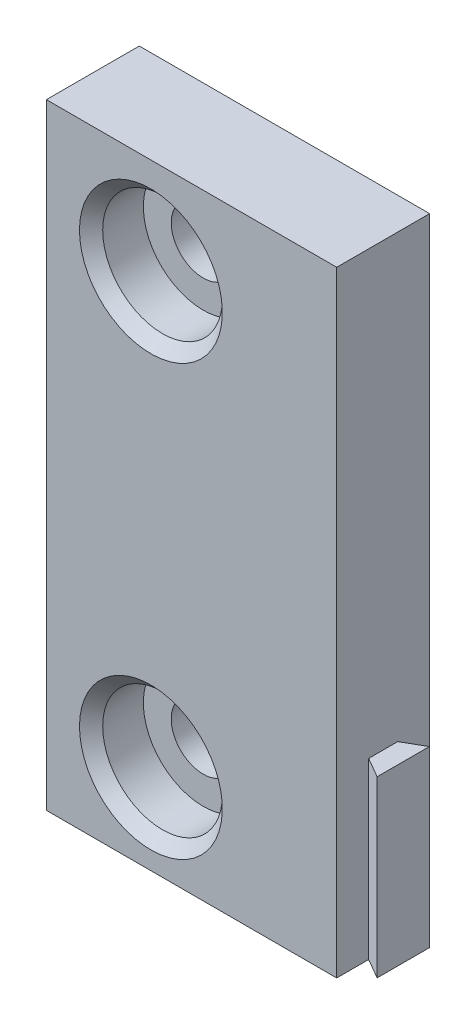
ISO-10303-21;
HEADER;
FILE_DESCRIPTION(('STEP AP214'),'2;1');
FILE_NAME('part.step','',(''),(''),'','','');
FILE_SCHEMA(('AUTOMOTIVE_DESIGN { 1 0 10303 214 1 1 1 1 }'));
ENDSEC;
DATA;
#1=APPLICATION_CONTEXT('core data for automotive mechanical design processes');
#2=APPLICATION_PROTOCOL_DEFINITION('international standard','automotive_design',2000,#1);
#3=PRODUCT_CONTEXT('',#1,'mechanical');
#4=PRODUCT('Part','Part','',(#3));
#5=PRODUCT_RELATED_PRODUCT_CATEGORY('part','',(#4));
#6=PRODUCT_DEFINITION_FORMATION('','',#4);
#7=PRODUCT_DEFINITION_CONTEXT('part definition',#1,'design');
#8=PRODUCT_DEFINITION('design','',#6,#7);
#9=PRODUCT_DEFINITION_SHAPE('','',#8);
#10=(LENGTH_UNIT() NAMED_UNIT(*) SI_UNIT(.MILLI.,.METRE.));
#11=(NAMED_UNIT(*) PLANE_ANGLE_UNIT() SI_UNIT($,.RADIAN.));
#12=(NAMED_UNIT(*) SI_UNIT($,.STERADIAN.) SOLID_ANGLE_UNIT());
#13=UNCERTAINTY_MEASURE_WITH_UNIT(LENGTH_MEASURE(1.E-05),#10,'distance_accuracy_value','');
#14=(GEOMETRIC_REPRESENTATION_CONTEXT(3) GLOBAL_UNCERTAINTY_ASSIGNED_CONTEXT((#13)) GLOBAL_UNIT_ASSIGNED_CONTEXT((#10,
#11,#12)) REPRESENTATION_CONTEXT('',''));
#15=CARTESIAN_POINT('',(0.,0.,0.));
#16=DIRECTION('',(0.,0.,1.));
#17=DIRECTION('',(1.,0.,0.));
#18=AXIS2_PLACEMENT_3D('',#15,#16,#17);
#19=CARTESIAN_POINT('',(9.,44.7,8.));
#20=DIRECTION('',(0.,0.,-1.));
#21=DIRECTION('',(-1.,0.,0.));
#22=AXIS2_PLACEMENT_3D('',#19,#20,#21);
#23=CYLINDRICAL_SURFACE('',#22,2.75);
#24=CARTESIAN_POINT('',(9.,44.7,0.));
#25=DIRECTION('',(0.,0.,1.));
#26=DIRECTION('',(1.,0.,0.));
#27=AXIS2_PLACEMENT_3D('',#24,#25,#26);
#28=CIRCLE('',#27,2.75);
#29=CARTESIAN_POINT('',(11.75,44.7,0.));
#30=VERTEX_POINT('',#29);
#31=EDGE_CURVE('E177',#30,#30,#28,.T.);
#32=ORIENTED_EDGE('',*,*,#31,.F.);
#33=EDGE_LOOP('',(#32));
#34=FACE_BOUND('',#33,.T.);
#35=CARTESIAN_POINT('',(9.,44.7,3.5));
#36=DIRECTION('',(0.,0.,1.));
#37=DIRECTION('',(1.,0.,0.));
#38=AXIS2_PLACEMENT_3D('',#35,#36,#37);
#39=CIRCLE('',#38,2.75);
#40=CARTESIAN_POINT('',(11.75,44.7,3.5));
#41=VERTEX_POINT('',#40);
#42=EDGE_CURVE('E162',#41,#41,#39,.T.);
#43=ORIENTED_EDGE('',*,*,#42,.T.);
#44=EDGE_LOOP('',(#43));
#45=FACE_BOUND('',#44,.T.);
#46=ADVANCED_FACE('F45',(#34,#45),#23,.F.);
#47=CARTESIAN_POINT('',(9.,7.7,8.));
#48=DIRECTION('',(0.,0.,-1.));
#49=DIRECTION('',(-1.,0.,0.));
#50=AXIS2_PLACEMENT_3D('',#47,#48,#49);
#51=CYLINDRICAL_SURFACE('',#50,2.75);
#52=CARTESIAN_POINT('',(9.,7.7,0.));
#53=DIRECTION('',(0.,0.,1.));
#54=DIRECTION('',(1.,0.,0.));
#55=AXIS2_PLACEMENT_3D('',#52,#53,#54);
#56=CIRCLE('',#55,2.75);
#57=CARTESIAN_POINT('',(11.75,7.7,0.));
#58=VERTEX_POINT('',#57);
#59=EDGE_CURVE('E168',#58,#58,#56,.T.);
#60=ORIENTED_EDGE('',*,*,#59,.F.);
#61=EDGE_LOOP('',(#60));
#62=FACE_BOUND('',#61,.T.);
#63=CARTESIAN_POINT('',(9.,7.7,3.5));
#64=DIRECTION('',(0.,0.,1.));
#65=DIRECTION('',(1.,0.,0.));
#66=AXIS2_PLACEMENT_3D('',#63,#64,#65);
#67=CIRCLE('',#66,2.75);
#68=CARTESIAN_POINT('',(11.75,7.7,3.5));
#69=VERTEX_POINT('',#68);
#70=EDGE_CURVE('E218',#69,#69,#67,.T.);
#71=ORIENTED_EDGE('',*,*,#70,.T.);
#72=EDGE_LOOP('',(#71));
#73=FACE_BOUND('',#72,.T.);
#74=ADVANCED_FACE('F272',(#62,#73),#51,.F.);
#75=CARTESIAN_POINT('',(25.,0.,8.));
#76=DIRECTION('',(-1.,0.,0.));
#77=DIRECTION('',(0.,-1.,0.));
#78=AXIS2_PLACEMENT_3D('',#75,#76,#77);
#79=PLANE('',#78);
#80=DIRECTION('',(0.,-1.,0.));
#81=VECTOR('',#80,1.);
#82=CARTESIAN_POINT('',(25.,15.,5.25));
#83=LINE('',#82,#81);
#84=CARTESIAN_POINT('',(25.,15.,5.25));
#85=VERTEX_POINT('',#84);
#86=CARTESIAN_POINT('',(25.,0.,5.25));
#87=VERTEX_POINT('',#86);
#88=EDGE_CURVE('E144',#85,#87,#83,.T.);
#89=ORIENTED_EDGE('',*,*,#88,.F.);
#90=DIRECTION('',(0.,0.,-1.));
#91=VECTOR('',#90,1.);
#92=CARTESIAN_POINT('',(25.,15.,2.75));
#93=LINE('',#92,#91);
#94=CARTESIAN_POINT('',(25.,15.,2.75));
#95=VERTEX_POINT('',#94);
#96=EDGE_CURVE('E135',#85,#95,#93,.T.);
#97=ORIENTED_EDGE('',*,*,#96,.T.);
#98=DIRECTION('',(0.,-1.,0.));
#99=VECTOR('',#98,1.);
#100=CARTESIAN_POINT('',(25.,15.,2.75));
#101=LINE('',#100,#99);
#102=CARTESIAN_POINT('',(25.,0.,2.75));
#103=VERTEX_POINT('',#102);
#104=EDGE_CURVE('E120',#95,#103,#101,.T.);
#105=ORIENTED_EDGE('',*,*,#104,.T.);
#106=DIRECTION('',(0.,0.,-1.));
#107=VECTOR('',#106,1.);
#108=CARTESIAN_POINT('',(25.,0.,8.));
#109=LINE('',#108,#107);
#110=CARTESIAN_POINT('',(25.,0.,0.));
#111=VERTEX_POINT('',#110);
#112=EDGE_CURVE('E210',#103,#111,#109,.T.);
#113=ORIENTED_EDGE('',*,*,#112,.T.);
#114=DIRECTION('',(0.,1.,0.));
#115=VECTOR('',#114,1.);
#116=CARTESIAN_POINT('',(25.,0.,0.));
#117=LINE('',#116,#115);
#118=CARTESIAN_POINT('',(25.,53.,0.));
#119=VERTEX_POINT('',#118);
#120=EDGE_CURVE('E200',#111,#119,#117,.T.);
#121=ORIENTED_EDGE('',*,*,#120,.T.);
#122=DIRECTION('',(0.,0.,-1.));
#123=VECTOR('',#122,1.);
#124=CARTESIAN_POINT('',(25.,53.,8.));
#125=LINE('',#124,#123);
#126=CARTESIAN_POINT('',(25.,53.,8.));
#127=VERTEX_POINT('',#126);
#128=EDGE_CURVE('E207',#127,#119,#125,.T.);
#129=ORIENTED_EDGE('',*,*,#128,.F.);
#130=DIRECTION('',(0.,1.,0.));
#131=VECTOR('',#130,1.);
#132=CARTESIAN_POINT('',(25.,0.,8.));
#133=LINE('',#132,#131);
#134=CARTESIAN_POINT('',(25.,0.,8.));
#135=VERTEX_POINT('',#134);
#136=EDGE_CURVE('E187',#135,#127,#133,.T.);
#137=ORIENTED_EDGE('',*,*,#136,.F.);
#138=EDGE_CURVE('E211',#135,#87,#109,.T.);
#139=ORIENTED_EDGE('',*,*,#138,.T.);
#140=EDGE_LOOP('',(#89,#97,#105,#113,#121,#129,#137,#139));
#141=FACE_BOUND('',#140,.T.);
#142=ADVANCED_FACE('F142',(#141),#79,.F.);
#143=CARTESIAN_POINT('',(0.,0.,8.));
#144=DIRECTION('',(0.,0.,-1.));
#145=DIRECTION('',(-1.,0.,0.));
#146=AXIS2_PLACEMENT_3D('',#143,#144,#145);
#147=PLANE('',#146);
#148=CARTESIAN_POINT('',(9.,7.7,8.));
#149=DIRECTION('',(0.,0.,-1.));
#150=DIRECTION('',(-1.,0.,0.));
#151=AXIS2_PLACEMENT_3D('',#148,#149,#150);
#152=CIRCLE('',#151,6.15000000000001);
#153=CARTESIAN_POINT('',(2.84999999999999,7.7,8.));
#154=VERTEX_POINT('',#153);
#155=EDGE_CURVE('E55',#154,#154,#152,.T.);
#156=ORIENTED_EDGE('',*,*,#155,.T.);
#157=EDGE_LOOP('',(#156));
#158=FACE_BOUND('',#157,.T.);
#159=CARTESIAN_POINT('',(9.,44.7,8.));
#160=DIRECTION('',(0.,0.,-1.));
#161=DIRECTION('',(-1.,0.,0.));
#162=AXIS2_PLACEMENT_3D('',#159,#160,#161);
#163=CIRCLE('',#162,6.15000000000001);
#164=CARTESIAN_POINT('',(2.84999999999999,44.7,8.));
#165=VERTEX_POINT('',#164);
#166=EDGE_CURVE('E229',#165,#165,#163,.T.);
#167=ORIENTED_EDGE('',*,*,#166,.T.);
#168=EDGE_LOOP('',(#167));
#169=FACE_BOUND('',#168,.T.);
#170=DIRECTION('',(0.,-1.,0.));
#171=VECTOR('',#170,1.);
#172=CARTESIAN_POINT('',(0.,0.,8.));
#173=LINE('',#172,#171);
#174=CARTESIAN_POINT('',(0.,53.,8.));
#175=VERTEX_POINT('',#174);
#176=CARTESIAN_POINT('',(0.,0.,8.));
#177=VERTEX_POINT('',#176);
#178=EDGE_CURVE('E182',#175,#177,#173,.T.);
#179=ORIENTED_EDGE('',*,*,#178,.T.);
#180=DIRECTION('',(1.,0.,0.));
#181=VECTOR('',#180,1.);
#182=CARTESIAN_POINT('',(0.,0.,8.));
#183=LINE('',#182,#181);
#184=EDGE_CURVE('E100',#177,#135,#183,.T.);
#185=ORIENTED_EDGE('',*,*,#184,.T.);
#186=ORIENTED_EDGE('',*,*,#136,.T.);
#187=DIRECTION('',(-1.,0.,0.));
#188=VECTOR('',#187,1.);
#189=CARTESIAN_POINT('',(0.,53.,8.));
#190=LINE('',#189,#188);
#191=EDGE_CURVE('E71',#127,#175,#190,.T.);
#192=ORIENTED_EDGE('',*,*,#191,.T.);
#193=EDGE_LOOP('',(#179,#185,#186,#192));
#194=FACE_BOUND('',#193,.T.);
#195=ADVANCED_FACE('F236',(#158,#169,#194),#147,.F.);
#196=CARTESIAN_POINT('',(0.,0.,0.));
#197=DIRECTION('',(0.,0.,-1.));
#198=DIRECTION('',(-1.,0.,0.));
#199=AXIS2_PLACEMENT_3D('',#196,#197,#198);
#200=PLANE('',#199);
#201=ORIENTED_EDGE('',*,*,#31,.T.);
#202=EDGE_LOOP('',(#201));
#203=FACE_BOUND('',#202,.T.);
#204=DIRECTION('',(0.,-1.,0.));
#205=VECTOR('',#204,1.);
#206=CARTESIAN_POINT('',(0.,0.,0.));
#207=LINE('',#206,#205);
#208=CARTESIAN_POINT('',(0.,53.,0.));
#209=VERTEX_POINT('',#208);
#210=CARTESIAN_POINT('',(0.,0.,0.));
#211=VERTEX_POINT('',#210);
#212=EDGE_CURVE('E181',#209,#211,#207,.T.);
#213=ORIENTED_EDGE('',*,*,#212,.F.);
#214=DIRECTION('',(-1.,0.,0.));
#215=VECTOR('',#214,1.);
#216=CARTESIAN_POINT('',(0.,53.,0.));
#217=LINE('',#216,#215);
#218=EDGE_CURVE('E92',#119,#209,#217,.T.);
#219=ORIENTED_EDGE('',*,*,#218,.F.);
#220=ORIENTED_EDGE('',*,*,#120,.F.);
#221=DIRECTION('',(1.,0.,0.));
#222=VECTOR('',#221,1.);
#223=CARTESIAN_POINT('',(0.,0.,0.));
#224=LINE('',#223,#222);
#225=EDGE_CURVE('E196',#211,#111,#224,.T.);
#226=ORIENTED_EDGE('',*,*,#225,.F.);
#227=EDGE_LOOP('',(#213,#219,#220,#226));
#228=FACE_BOUND('',#227,.T.);
#229=ORIENTED_EDGE('',*,*,#59,.T.);
#230=EDGE_LOOP('',(#229));
#231=FACE_BOUND('',#230,.T.);
#232=ADVANCED_FACE('F286',(#203,#228,#231),#200,.T.);
#233=CARTESIAN_POINT('',(0.,0.,8.));
#234=DIRECTION('',(1.,0.,0.));
#235=DIRECTION('',(0.,1.,0.));
#236=AXIS2_PLACEMENT_3D('',#233,#234,#235);
#237=PLANE('',#236);
#238=ORIENTED_EDGE('',*,*,#212,.T.);
#239=DIRECTION('',(0.,0.,-1.));
#240=VECTOR('',#239,1.);
#241=CARTESIAN_POINT('',(0.,0.,8.));
#242=LINE('',#241,#240);
#243=EDGE_CURVE('E214',#177,#211,#242,.T.);
#244=ORIENTED_EDGE('',*,*,#243,.F.);
#245=ORIENTED_EDGE('',*,*,#178,.F.);
#246=DIRECTION('',(0.,0.,-1.));
#247=VECTOR('',#246,1.);
#248=CARTESIAN_POINT('',(0.,53.,8.));
#249=LINE('',#248,#247);
#250=EDGE_CURVE('E192',#175,#209,#249,.T.);
#251=ORIENTED_EDGE('',*,*,#250,.T.);
#252=EDGE_LOOP('',(#238,#244,#245,#251));
#253=FACE_BOUND('',#252,.T.);
#254=ADVANCED_FACE('F289',(#253),#237,.F.);
#255=CARTESIAN_POINT('',(0.,0.,8.));
#256=DIRECTION('',(0.,1.,0.));
#257=DIRECTION('',(0.,0.,1.));
#258=AXIS2_PLACEMENT_3D('',#255,#256,#257);
#259=PLANE('',#258);
#260=ORIENTED_EDGE('',*,*,#225,.T.);
#261=ORIENTED_EDGE('',*,*,#112,.F.);
#262=DIRECTION('',(0.86602540378444,0.,-0.499999999999998));
#263=VECTOR('',#262,1.);
#264=CARTESIAN_POINT('',(25.,0.,2.75));
#265=LINE('',#264,#263);
#266=CARTESIAN_POINT('',(26.7320508075689,0.,1.75));
#267=VERTEX_POINT('',#266);
#268=EDGE_CURVE('E62',#103,#267,#265,.T.);
#269=ORIENTED_EDGE('',*,*,#268,.T.);
#270=DIRECTION('',(0.,0.,1.));
#271=VECTOR('',#270,1.);
#272=CARTESIAN_POINT('',(26.7320508075689,0.,1.75));
#273=LINE('',#272,#271);
#274=CARTESIAN_POINT('',(26.7320508075689,0.,6.25));
#275=VERTEX_POINT('',#274);
#276=EDGE_CURVE('E150',#267,#275,#273,.T.);
#277=ORIENTED_EDGE('',*,*,#276,.T.);
#278=DIRECTION('',(-0.86602540378444,0.,-0.499999999999998));
#279=VECTOR('',#278,1.);
#280=CARTESIAN_POINT('',(26.7320508075689,0.,6.25));
#281=LINE('',#280,#279);
#282=EDGE_CURVE('E146',#275,#87,#281,.T.);
#283=ORIENTED_EDGE('',*,*,#282,.T.);
#284=ORIENTED_EDGE('',*,*,#138,.F.);
#285=ORIENTED_EDGE('',*,*,#184,.F.);
#286=ORIENTED_EDGE('',*,*,#243,.T.);
#287=EDGE_LOOP('',(#260,#261,#269,#277,#283,#284,#285,#286));
#288=FACE_BOUND('',#287,.T.);
#289=ADVANCED_FACE('F295',(#288),#259,.F.);
#290=CARTESIAN_POINT('',(0.,53.,8.));
#291=DIRECTION('',(0.,-1.,0.));
#292=DIRECTION('',(0.,0.,-1.));
#293=AXIS2_PLACEMENT_3D('',#290,#291,#292);
#294=PLANE('',#293);
#295=ORIENTED_EDGE('',*,*,#218,.T.);
#296=ORIENTED_EDGE('',*,*,#250,.F.);
#297=ORIENTED_EDGE('',*,*,#191,.F.);
#298=ORIENTED_EDGE('',*,*,#128,.T.);
#299=EDGE_LOOP('',(#295,#296,#297,#298));
#300=FACE_BOUND('',#299,.T.);
#301=ADVANCED_FACE('F291',(#300),#294,.F.);
#302=CARTESIAN_POINT('',(26.7320508075689,15.,6.25));
#303=DIRECTION('',(-0.499999999999998,0.,0.86602540378444));
#304=DIRECTION('',(0.86602540378444,0.,0.499999999999998));
#305=AXIS2_PLACEMENT_3D('',#302,#303,#304);
#306=PLANE('',#305);
#307=ORIENTED_EDGE('',*,*,#282,.F.);
#308=DIRECTION('',(0.,-1.,0.));
#309=VECTOR('',#308,1.);
#310=CARTESIAN_POINT('',(26.7320508075689,15.,6.25));
#311=LINE('',#310,#309);
#312=CARTESIAN_POINT('',(26.7320508075689,15.,6.25));
#313=VERTEX_POINT('',#312);
#314=EDGE_CURVE('E169',#313,#275,#311,.T.);
#315=ORIENTED_EDGE('',*,*,#314,.F.);
#316=DIRECTION('',(-0.86602540378444,0.,-0.499999999999998));
#317=VECTOR('',#316,1.);
#318=CARTESIAN_POINT('',(26.7320508075689,15.,6.25));
#319=LINE('',#318,#317);
#320=EDGE_CURVE('E129',#313,#85,#319,.T.);
#321=ORIENTED_EDGE('',*,*,#320,.T.);
#322=ORIENTED_EDGE('',*,*,#88,.T.);
#323=EDGE_LOOP('',(#307,#315,#321,#322));
#324=FACE_BOUND('',#323,.T.);
#325=ADVANCED_FACE('F294',(#324),#306,.T.);
#326=CARTESIAN_POINT('',(26.7320508075689,15.,1.75));
#327=DIRECTION('',(1.,0.,0.));
#328=DIRECTION('',(0.,0.,-1.));
#329=AXIS2_PLACEMENT_3D('',#326,#327,#328);
#330=PLANE('',#329);
#331=ORIENTED_EDGE('',*,*,#276,.F.);
#332=DIRECTION('',(0.,-1.,0.));
#333=VECTOR('',#332,1.);
#334=CARTESIAN_POINT('',(26.7320508075689,15.,1.75));
#335=LINE('',#334,#333);
#336=CARTESIAN_POINT('',(26.7320508075689,15.,1.75));
#337=VERTEX_POINT('',#336);
#338=EDGE_CURVE('E128',#337,#267,#335,.T.);
#339=ORIENTED_EDGE('',*,*,#338,.F.);
#340=DIRECTION('',(0.,0.,1.));
#341=VECTOR('',#340,1.);
#342=CARTESIAN_POINT('',(26.7320508075689,15.,1.75));
#343=LINE('',#342,#341);
#344=EDGE_CURVE('E138',#337,#313,#343,.T.);
#345=ORIENTED_EDGE('',*,*,#344,.T.);
#346=ORIENTED_EDGE('',*,*,#314,.T.);
#347=EDGE_LOOP('',(#331,#339,#345,#346));
#348=FACE_BOUND('',#347,.T.);
#349=ADVANCED_FACE('F322',(#348),#330,.T.);
#350=CARTESIAN_POINT('',(25.,15.,2.75));
#351=DIRECTION('',(-0.499999999999998,0.,-0.86602540378444));
#352=DIRECTION('',(-0.86602540378444,0.,0.499999999999998));
#353=AXIS2_PLACEMENT_3D('',#350,#351,#352);
#354=PLANE('',#353);
#355=ORIENTED_EDGE('',*,*,#268,.F.);
#356=ORIENTED_EDGE('',*,*,#104,.F.);
#357=DIRECTION('',(0.86602540378444,0.,-0.499999999999998));
#358=VECTOR('',#357,1.);
#359=CARTESIAN_POINT('',(25.,15.,2.75));
#360=LINE('',#359,#358);
#361=EDGE_CURVE('E123',#95,#337,#360,.T.);
#362=ORIENTED_EDGE('',*,*,#361,.T.);
#363=ORIENTED_EDGE('',*,*,#338,.T.);
#364=EDGE_LOOP('',(#355,#356,#362,#363));
#365=FACE_BOUND('',#364,.T.);
#366=ADVANCED_FACE('F122',(#365),#354,.T.);
#367=CARTESIAN_POINT('',(0.,15.,0.));
#368=DIRECTION('',(0.,-1.,0.));
#369=DIRECTION('',(0.,0.,-1.));
#370=AXIS2_PLACEMENT_3D('',#367,#368,#369);
#371=PLANE('',#370);
#372=ORIENTED_EDGE('',*,*,#96,.F.);
#373=ORIENTED_EDGE('',*,*,#320,.F.);
#374=ORIENTED_EDGE('',*,*,#344,.F.);
#375=ORIENTED_EDGE('',*,*,#361,.F.);
#376=EDGE_LOOP('',(#372,#373,#374,#375));
#377=FACE_BOUND('',#376,.T.);
#378=ADVANCED_FACE('F133',(#377),#371,.F.);
#379=CARTESIAN_POINT('',(9.,7.7,3.5));
#380=DIRECTION('',(0.,0.,1.));
#381=DIRECTION('',(1.,0.,0.));
#382=AXIS2_PLACEMENT_3D('',#379,#380,#381);
#383=CYLINDRICAL_SURFACE('',#382,5.15);
#384=CARTESIAN_POINT('',(9.,7.7,7.));
#385=DIRECTION('',(0.,0.,-1.));
#386=DIRECTION('',(-1.,0.,0.));
#387=AXIS2_PLACEMENT_3D('',#384,#385,#386);
#388=CIRCLE('',#387,5.15);
#389=CARTESIAN_POINT('',(3.84999999999999,7.7,7.));
#390=VERTEX_POINT('',#389);
#391=EDGE_CURVE('E217',#390,#390,#388,.F.);
#392=ORIENTED_EDGE('',*,*,#391,.T.);
#393=EDGE_LOOP('',(#392));
#394=FACE_BOUND('',#393,.T.);
#395=CARTESIAN_POINT('',(9.,7.7,3.5));
#396=DIRECTION('',(0.,0.,1.));
#397=DIRECTION('',(1.,0.,0.));
#398=AXIS2_PLACEMENT_3D('',#395,#396,#397);
#399=CIRCLE('',#398,5.15);
#400=CARTESIAN_POINT('',(14.15,7.7,3.5));
#401=VERTEX_POINT('',#400);
#402=EDGE_CURVE('E153',#401,#401,#399,.T.);
#403=ORIENTED_EDGE('',*,*,#402,.F.);
#404=EDGE_LOOP('',(#403));
#405=FACE_BOUND('',#404,.T.);
#406=ADVANCED_FACE('F245',(#394,#405),#383,.F.);
#407=CARTESIAN_POINT('',(9.,7.7,3.5));
#408=DIRECTION('',(0.,0.,1.));
#409=DIRECTION('',(1.,0.,0.));
#410=AXIS2_PLACEMENT_3D('',#407,#408,#409);
#411=PLANE('',#410);
#412=ORIENTED_EDGE('',*,*,#70,.F.);
#413=EDGE_LOOP('',(#412));
#414=FACE_BOUND('',#413,.T.);
#415=ORIENTED_EDGE('',*,*,#402,.T.);
#416=EDGE_LOOP('',(#415));
#417=FACE_BOUND('',#416,.T.);
#418=ADVANCED_FACE('F248',(#414,#417),#411,.T.);
#419=CARTESIAN_POINT('',(9.,44.7,3.5));
#420=DIRECTION('',(0.,0.,1.));
#421=DIRECTION('',(1.,0.,0.));
#422=AXIS2_PLACEMENT_3D('',#419,#420,#421);
#423=CYLINDRICAL_SURFACE('',#422,5.15000000000001);
#424=CARTESIAN_POINT('',(9.,44.7,7.));
#425=DIRECTION('',(0.,0.,-1.));
#426=DIRECTION('',(-1.,0.,0.));
#427=AXIS2_PLACEMENT_3D('',#424,#425,#426);
#428=CIRCLE('',#427,5.15000000000001);
#429=CARTESIAN_POINT('',(3.84999999999999,44.7,7.));
#430=VERTEX_POINT('',#429);
#431=EDGE_CURVE('E11',#430,#430,#428,.F.);
#432=ORIENTED_EDGE('',*,*,#431,.T.);
#433=EDGE_LOOP('',(#432));
#434=FACE_BOUND('',#433,.T.);
#435=CARTESIAN_POINT('',(9.,44.7,3.5));
#436=DIRECTION('',(0.,0.,1.));
#437=DIRECTION('',(1.,0.,0.));
#438=AXIS2_PLACEMENT_3D('',#435,#436,#437);
#439=CIRCLE('',#438,5.15000000000001);
#440=CARTESIAN_POINT('',(14.15,44.7,3.5));
#441=VERTEX_POINT('',#440);
#442=EDGE_CURVE('E222',#441,#441,#439,.T.);
#443=ORIENTED_EDGE('',*,*,#442,.F.);
#444=EDGE_LOOP('',(#443));
#445=FACE_BOUND('',#444,.T.);
#446=ADVANCED_FACE('F259',(#434,#445),#423,.F.);
#447=CARTESIAN_POINT('',(9.,44.7,3.5));
#448=DIRECTION('',(0.,0.,1.));
#449=DIRECTION('',(1.,0.,0.));
#450=AXIS2_PLACEMENT_3D('',#447,#448,#449);
#451=PLANE('',#450);
#452=ORIENTED_EDGE('',*,*,#42,.F.);
#453=EDGE_LOOP('',(#452));
#454=FACE_BOUND('',#453,.T.);
#455=ORIENTED_EDGE('',*,*,#442,.T.);
#456=EDGE_LOOP('',(#455));
#457=FACE_BOUND('',#456,.T.);
#458=ADVANCED_FACE('F242',(#454,#457),#451,.T.);
#459=CARTESIAN_POINT('',(9.,7.7,7.));
#460=DIRECTION('',(0.,0.,1.));
#461=DIRECTION('',(1.,0.,0.));
#462=AXIS2_PLACEMENT_3D('',#459,#460,#461);
#463=CONICAL_SURFACE('',#462,5.15,0.78539816339745);
#464=ORIENTED_EDGE('',*,*,#155,.F.);
#465=EDGE_LOOP('',(#464));
#466=FACE_BOUND('',#465,.T.);
#467=ORIENTED_EDGE('',*,*,#391,.F.);
#468=EDGE_LOOP('',(#467));
#469=FACE_BOUND('',#468,.T.);
#470=ADVANCED_FACE('F239',(#466,#469),#463,.F.);
#471=CARTESIAN_POINT('',(9.,44.7,7.));
#472=DIRECTION('',(0.,0.,1.));
#473=DIRECTION('',(1.,0.,0.));
#474=AXIS2_PLACEMENT_3D('',#471,#472,#473);
#475=CONICAL_SURFACE('',#474,5.15000000000001,0.78539816339745);
#476=ORIENTED_EDGE('',*,*,#166,.F.);
#477=EDGE_LOOP('',(#476));
#478=FACE_BOUND('',#477,.T.);
#479=ORIENTED_EDGE('',*,*,#431,.F.);
#480=EDGE_LOOP('',(#479));
#481=FACE_BOUND('',#480,.T.);
#482=ADVANCED_FACE('F48',(#478,#481),#475,.F.);
#483=CLOSED_SHELL('',(#46,#74,#142,#195,#232,#254,#289,#301,#325,#349,#366,#378,#406,#418,#446,
#458,#470,#482));
#484=MANIFOLD_SOLID_BREP('B2',#483);
#485=ADVANCED_BREP_SHAPE_REPRESENTATION('',(#18,#484),#14);
#486=SHAPE_DEFINITION_REPRESENTATION(#9,#485);
ENDSEC;
END-ISO-10303-21;
